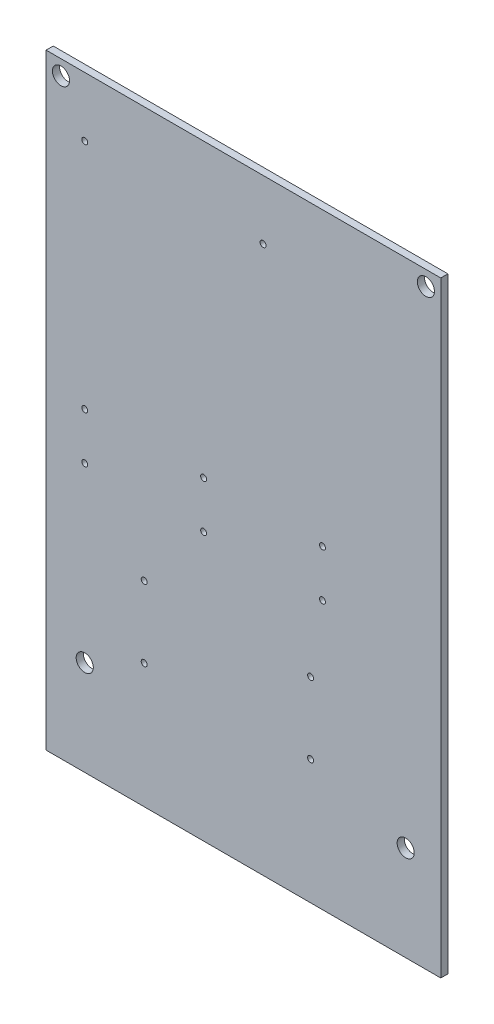
ISO-10303-21;
HEADER;
FILE_DESCRIPTION(('STEP AP214'),'2;1');
FILE_NAME('part.step','',(''),(''),'','','');
FILE_SCHEMA(('AUTOMOTIVE_DESIGN { 1 0 10303 214 1 1 1 1 }'));
ENDSEC;
DATA;
#1=APPLICATION_CONTEXT('core data for automotive mechanical design processes');
#2=APPLICATION_PROTOCOL_DEFINITION('international standard','automotive_design',2000,#1);
#3=PRODUCT_CONTEXT('',#1,'mechanical');
#4=PRODUCT('Part','Part','',(#3));
#5=PRODUCT_RELATED_PRODUCT_CATEGORY('part','',(#4));
#6=PRODUCT_DEFINITION_FORMATION('','',#4);
#7=PRODUCT_DEFINITION_CONTEXT('part definition',#1,'design');
#8=PRODUCT_DEFINITION('design','',#6,#7);
#9=PRODUCT_DEFINITION_SHAPE('','',#8);
#10=(LENGTH_UNIT() NAMED_UNIT(*) SI_UNIT(.MILLI.,.METRE.));
#11=(NAMED_UNIT(*) PLANE_ANGLE_UNIT() SI_UNIT($,.RADIAN.));
#12=(NAMED_UNIT(*) SI_UNIT($,.STERADIAN.) SOLID_ANGLE_UNIT());
#13=UNCERTAINTY_MEASURE_WITH_UNIT(LENGTH_MEASURE(1.E-05),#10,'distance_accuracy_value','');
#14=(GEOMETRIC_REPRESENTATION_CONTEXT(3) GLOBAL_UNCERTAINTY_ASSIGNED_CONTEXT((#13)) GLOBAL_UNIT_ASSIGNED_CONTEXT((#10,
#11,#12)) REPRESENTATION_CONTEXT('',''));
#15=CARTESIAN_POINT('',(0.,0.,0.));
#16=DIRECTION('',(0.,0.,1.));
#17=DIRECTION('',(1.,0.,0.));
#18=AXIS2_PLACEMENT_3D('',#15,#16,#17);
#19=CARTESIAN_POINT('',(42.164,82.55,1.524));
#20=DIRECTION('',(0.,0.,-1.));
#21=DIRECTION('',(-1.,0.,0.));
#22=AXIS2_PLACEMENT_3D('',#19,#20,#21);
#23=PLANE('',#22);
#24=CARTESIAN_POINT('',(14.351,-20.4,1.524));
#25=DIRECTION('',(0.,0.,1.));
#26=DIRECTION('',(1.,0.,0.));
#27=AXIS2_PLACEMENT_3D('',#24,#25,#26);
#28=CIRCLE('',#27,0.634999999999999);
#29=CARTESIAN_POINT('',(14.986,-20.4,1.524));
#30=VERTEX_POINT('',#29);
#31=EDGE_CURVE('E184',#30,#30,#28,.T.);
#32=ORIENTED_EDGE('',*,*,#31,.F.);
#33=EDGE_LOOP('',(#32));
#34=FACE_BOUND('',#33,.T.);
#35=CARTESIAN_POINT('',(-21.209,-20.4,1.524));
#36=DIRECTION('',(0.,0.,1.));
#37=DIRECTION('',(1.,0.,0.));
#38=AXIS2_PLACEMENT_3D('',#35,#36,#37);
#39=CIRCLE('',#38,0.634999999999999);
#40=CARTESIAN_POINT('',(-20.574,-20.4,1.524));
#41=VERTEX_POINT('',#40);
#42=EDGE_CURVE('E178',#41,#41,#39,.T.);
#43=ORIENTED_EDGE('',*,*,#42,.F.);
#44=EDGE_LOOP('',(#43));
#45=FACE_BOUND('',#44,.T.);
#46=CARTESIAN_POINT('',(14.351,-5.16,1.524));
#47=DIRECTION('',(0.,0.,1.));
#48=DIRECTION('',(1.,0.,0.));
#49=AXIS2_PLACEMENT_3D('',#46,#47,#48);
#50=CIRCLE('',#49,0.634999999999999);
#51=CARTESIAN_POINT('',(14.986,-5.16,1.524));
#52=VERTEX_POINT('',#51);
#53=EDGE_CURVE('E172',#52,#52,#50,.T.);
#54=ORIENTED_EDGE('',*,*,#53,.F.);
#55=EDGE_LOOP('',(#54));
#56=FACE_BOUND('',#55,.T.);
#57=CARTESIAN_POINT('',(-21.209,-5.16,1.524));
#58=DIRECTION('',(0.,0.,1.));
#59=DIRECTION('',(1.,0.,0.));
#60=AXIS2_PLACEMENT_3D('',#57,#58,#59);
#61=CIRCLE('',#60,0.634999999999999);
#62=CARTESIAN_POINT('',(-20.574,-5.16,1.524));
#63=VERTEX_POINT('',#62);
#64=EDGE_CURVE('E166',#63,#63,#61,.T.);
#65=ORIENTED_EDGE('',*,*,#64,.F.);
#66=EDGE_LOOP('',(#65));
#67=FACE_BOUND('',#66,.T.);
#68=CARTESIAN_POINT('',(16.891,10.24,1.524));
#69=DIRECTION('',(0.,0.,1.));
#70=DIRECTION('',(1.,0.,0.));
#71=AXIS2_PLACEMENT_3D('',#68,#69,#70);
#72=CIRCLE('',#71,0.634999999999995);
#73=CARTESIAN_POINT('',(17.526,10.24,1.524));
#74=VERTEX_POINT('',#73);
#75=EDGE_CURVE('E160',#74,#74,#72,.T.);
#76=ORIENTED_EDGE('',*,*,#75,.F.);
#77=EDGE_LOOP('',(#76));
#78=FACE_BOUND('',#77,.T.);
#79=CARTESIAN_POINT('',(16.891,20.24,1.524));
#80=DIRECTION('',(0.,0.,1.));
#81=DIRECTION('',(1.,0.,0.));
#82=AXIS2_PLACEMENT_3D('',#79,#80,#81);
#83=CIRCLE('',#82,0.634999999999995);
#84=CARTESIAN_POINT('',(17.526,20.24,1.524));
#85=VERTEX_POINT('',#84);
#86=EDGE_CURVE('E154',#85,#85,#83,.T.);
#87=ORIENTED_EDGE('',*,*,#86,.F.);
#88=EDGE_LOOP('',(#87));
#89=FACE_BOUND('',#88,.T.);
#90=CARTESIAN_POINT('',(-8.509,10.24,1.524));
#91=DIRECTION('',(0.,0.,1.));
#92=DIRECTION('',(1.,0.,0.));
#93=AXIS2_PLACEMENT_3D('',#90,#91,#92);
#94=CIRCLE('',#93,0.634999999999995);
#95=CARTESIAN_POINT('',(-7.87400000000001,10.24,1.524));
#96=VERTEX_POINT('',#95);
#97=EDGE_CURVE('E148',#96,#96,#94,.T.);
#98=ORIENTED_EDGE('',*,*,#97,.F.);
#99=EDGE_LOOP('',(#98));
#100=FACE_BOUND('',#99,.T.);
#101=CARTESIAN_POINT('',(-8.509,20.24,1.524));
#102=DIRECTION('',(0.,0.,1.));
#103=DIRECTION('',(1.,0.,0.));
#104=AXIS2_PLACEMENT_3D('',#101,#102,#103);
#105=CIRCLE('',#104,0.634999999999995);
#106=CARTESIAN_POINT('',(-7.87400000000001,20.24,1.524));
#107=VERTEX_POINT('',#106);
#108=EDGE_CURVE('E142',#107,#107,#105,.T.);
#109=ORIENTED_EDGE('',*,*,#108,.F.);
#110=EDGE_LOOP('',(#109));
#111=FACE_BOUND('',#110,.T.);
#112=CARTESIAN_POINT('',(-33.909,10.24,1.524));
#113=DIRECTION('',(0.,0.,1.));
#114=DIRECTION('',(1.,0.,0.));
#115=AXIS2_PLACEMENT_3D('',#112,#113,#114);
#116=CIRCLE('',#115,0.634999999999995);
#117=CARTESIAN_POINT('',(-33.274,10.24,1.524));
#118=VERTEX_POINT('',#117);
#119=EDGE_CURVE('E136',#118,#118,#116,.T.);
#120=ORIENTED_EDGE('',*,*,#119,.F.);
#121=EDGE_LOOP('',(#120));
#122=FACE_BOUND('',#121,.T.);
#123=CARTESIAN_POINT('',(-33.909,20.24,1.524));
#124=DIRECTION('',(0.,0.,1.));
#125=DIRECTION('',(1.,0.,0.));
#126=AXIS2_PLACEMENT_3D('',#123,#124,#125);
#127=CIRCLE('',#126,0.634999999999995);
#128=CARTESIAN_POINT('',(-33.274,20.24,1.524));
#129=VERTEX_POINT('',#128);
#130=EDGE_CURVE('E130',#129,#129,#127,.T.);
#131=ORIENTED_EDGE('',*,*,#130,.F.);
#132=EDGE_LOOP('',(#131));
#133=FACE_BOUND('',#132,.T.);
#134=CARTESIAN_POINT('',(4.19100000000001,69.85,1.524));
#135=DIRECTION('',(0.,0.,1.));
#136=DIRECTION('',(1.,0.,0.));
#137=AXIS2_PLACEMENT_3D('',#134,#135,#136);
#138=CIRCLE('',#137,0.634999999999999);
#139=CARTESIAN_POINT('',(4.82600000000001,69.85,1.524));
#140=VERTEX_POINT('',#139);
#141=EDGE_CURVE('E124',#140,#140,#138,.T.);
#142=ORIENTED_EDGE('',*,*,#141,.F.);
#143=EDGE_LOOP('',(#142));
#144=FACE_BOUND('',#143,.T.);
#145=CARTESIAN_POINT('',(-33.909,69.85,1.524));
#146=DIRECTION('',(0.,0.,1.));
#147=DIRECTION('',(1.,0.,0.));
#148=AXIS2_PLACEMENT_3D('',#145,#146,#147);
#149=CIRCLE('',#148,0.634999999999996);
#150=CARTESIAN_POINT('',(-33.274,69.85,1.524));
#151=VERTEX_POINT('',#150);
#152=EDGE_CURVE('E118',#151,#151,#149,.T.);
#153=ORIENTED_EDGE('',*,*,#152,.F.);
#154=EDGE_LOOP('',(#153));
#155=FACE_BOUND('',#154,.T.);
#156=CARTESIAN_POINT('',(-33.909,-26.67,1.524));
#157=DIRECTION('',(0.,0.,1.));
#158=DIRECTION('',(1.,0.,0.));
#159=AXIS2_PLACEMENT_3D('',#156,#157,#158);
#160=CIRCLE('',#159,1.8288);
#161=CARTESIAN_POINT('',(-35.7378,-26.67,1.524));
#162=VERTEX_POINT('',#161);
#163=EDGE_CURVE('E103',#162,#162,#160,.T.);
#164=ORIENTED_EDGE('',*,*,#163,.F.);
#165=EDGE_LOOP('',(#164));
#166=FACE_BOUND('',#165,.T.);
#167=CARTESIAN_POINT('',(-38.989,79.375,1.524));
#168=DIRECTION('',(0.,0.,1.));
#169=DIRECTION('',(1.,0.,0.));
#170=AXIS2_PLACEMENT_3D('',#167,#168,#169);
#171=CIRCLE('',#170,1.8288);
#172=CARTESIAN_POINT('',(-40.8178,79.375,1.524));
#173=VERTEX_POINT('',#172);
#174=EDGE_CURVE('E91',#173,#173,#171,.T.);
#175=ORIENTED_EDGE('',*,*,#174,.F.);
#176=EDGE_LOOP('',(#175));
#177=FACE_BOUND('',#176,.T.);
#178=DIRECTION('',(0.,-1.,0.));
#179=VECTOR('',#178,1.);
#180=CARTESIAN_POINT('',(-42.164,-82.55,1.524));
#181=LINE('',#180,#179);
#182=CARTESIAN_POINT('',(-42.164,82.55,1.524));
#183=VERTEX_POINT('',#182);
#184=CARTESIAN_POINT('',(-42.164,-46.99,1.524));
#185=VERTEX_POINT('',#184);
#186=EDGE_CURVE('E80',#183,#185,#181,.T.);
#187=ORIENTED_EDGE('',*,*,#186,.T.);
#188=DIRECTION('',(-1.,0.,0.));
#189=VECTOR('',#188,1.);
#190=CARTESIAN_POINT('',(-42.164,-46.99,1.524));
#191=LINE('',#190,#189);
#192=CARTESIAN_POINT('',(42.164,-46.99,1.524));
#193=VERTEX_POINT('',#192);
#194=EDGE_CURVE('E45',#193,#185,#191,.T.);
#195=ORIENTED_EDGE('',*,*,#194,.F.);
#196=DIRECTION('',(0.,1.,0.));
#197=VECTOR('',#196,1.);
#198=CARTESIAN_POINT('',(42.164,-82.55,1.524));
#199=LINE('',#198,#197);
#200=CARTESIAN_POINT('',(42.164,82.55,1.524));
#201=VERTEX_POINT('',#200);
#202=EDGE_CURVE('E86',#193,#201,#199,.T.);
#203=ORIENTED_EDGE('',*,*,#202,.T.);
#204=DIRECTION('',(-1.,0.,0.));
#205=VECTOR('',#204,1.);
#206=CARTESIAN_POINT('',(-42.164,82.55,1.524));
#207=LINE('',#206,#205);
#208=EDGE_CURVE('E54',#201,#183,#207,.T.);
#209=ORIENTED_EDGE('',*,*,#208,.T.);
#210=EDGE_LOOP('',(#187,#195,#203,#209));
#211=FACE_BOUND('',#210,.T.);
#212=CARTESIAN_POINT('',(38.989,79.375,1.524));
#213=DIRECTION('',(0.,0.,1.));
#214=DIRECTION('',(1.,0.,0.));
#215=AXIS2_PLACEMENT_3D('',#212,#213,#214);
#216=CIRCLE('',#215,1.8288);
#217=CARTESIAN_POINT('',(37.1602,79.375,1.524));
#218=VERTEX_POINT('',#217);
#219=EDGE_CURVE('E97',#218,#218,#216,.T.);
#220=ORIENTED_EDGE('',*,*,#219,.F.);
#221=EDGE_LOOP('',(#220));
#222=FACE_BOUND('',#221,.T.);
#223=CARTESIAN_POINT('',(34.671,-26.67,1.524));
#224=DIRECTION('',(0.,0.,1.));
#225=DIRECTION('',(1.,0.,0.));
#226=AXIS2_PLACEMENT_3D('',#223,#224,#225);
#227=CIRCLE('',#226,1.8288);
#228=CARTESIAN_POINT('',(32.8422,-26.67,1.524));
#229=VERTEX_POINT('',#228);
#230=EDGE_CURVE('E109',#229,#229,#227,.T.);
#231=ORIENTED_EDGE('',*,*,#230,.F.);
#232=EDGE_LOOP('',(#231));
#233=FACE_BOUND('',#232,.T.);
#234=ADVANCED_FACE('F30',(#34,#45,#56,#67,#78,#89,#100,#111,#122,#133,#144,#155,#166,#177,#211,
#222,#233),#23,.F.);
#235=CARTESIAN_POINT('',(42.164,82.55,0.));
#236=DIRECTION('',(0.,0.,-1.));
#237=DIRECTION('',(-1.,0.,0.));
#238=AXIS2_PLACEMENT_3D('',#235,#236,#237);
#239=PLANE('',#238);
#240=DIRECTION('',(-1.,0.,0.));
#241=VECTOR('',#240,1.);
#242=CARTESIAN_POINT('',(-42.164,-46.99,0.));
#243=LINE('',#242,#241);
#244=CARTESIAN_POINT('',(42.164,-46.99,0.));
#245=VERTEX_POINT('',#244);
#246=CARTESIAN_POINT('',(-42.164,-46.99,0.));
#247=VERTEX_POINT('',#246);
#248=EDGE_CURVE('E85',#245,#247,#243,.T.);
#249=ORIENTED_EDGE('',*,*,#248,.T.);
#250=DIRECTION('',(0.,-1.,0.));
#251=VECTOR('',#250,1.);
#252=CARTESIAN_POINT('',(-42.164,-82.55,0.));
#253=LINE('',#252,#251);
#254=CARTESIAN_POINT('',(-42.164,82.55,0.));
#255=VERTEX_POINT('',#254);
#256=EDGE_CURVE('E74',#255,#247,#253,.T.);
#257=ORIENTED_EDGE('',*,*,#256,.F.);
#258=DIRECTION('',(-1.,0.,0.));
#259=VECTOR('',#258,1.);
#260=CARTESIAN_POINT('',(-42.164,82.55,0.));
#261=LINE('',#260,#259);
#262=CARTESIAN_POINT('',(42.164,82.55,0.));
#263=VERTEX_POINT('',#262);
#264=EDGE_CURVE('E66',#263,#255,#261,.T.);
#265=ORIENTED_EDGE('',*,*,#264,.F.);
#266=DIRECTION('',(0.,1.,0.));
#267=VECTOR('',#266,1.);
#268=CARTESIAN_POINT('',(42.164,-82.55,0.));
#269=LINE('',#268,#267);
#270=EDGE_CURVE('E75',#245,#263,#269,.T.);
#271=ORIENTED_EDGE('',*,*,#270,.F.);
#272=EDGE_LOOP('',(#249,#257,#265,#271));
#273=FACE_BOUND('',#272,.T.);
#274=CARTESIAN_POINT('',(14.351,-20.4,0.));
#275=DIRECTION('',(0.,0.,1.));
#276=DIRECTION('',(1.,0.,0.));
#277=AXIS2_PLACEMENT_3D('',#274,#275,#276);
#278=CIRCLE('',#277,0.634999999999999);
#279=CARTESIAN_POINT('',(14.986,-20.4,0.));
#280=VERTEX_POINT('',#279);
#281=EDGE_CURVE('E181',#280,#280,#278,.T.);
#282=ORIENTED_EDGE('',*,*,#281,.T.);
#283=EDGE_LOOP('',(#282));
#284=FACE_BOUND('',#283,.T.);
#285=CARTESIAN_POINT('',(-21.209,-20.4,0.));
#286=DIRECTION('',(0.,0.,1.));
#287=DIRECTION('',(1.,0.,0.));
#288=AXIS2_PLACEMENT_3D('',#285,#286,#287);
#289=CIRCLE('',#288,0.634999999999999);
#290=CARTESIAN_POINT('',(-20.574,-20.4,0.));
#291=VERTEX_POINT('',#290);
#292=EDGE_CURVE('E175',#291,#291,#289,.T.);
#293=ORIENTED_EDGE('',*,*,#292,.T.);
#294=EDGE_LOOP('',(#293));
#295=FACE_BOUND('',#294,.T.);
#296=CARTESIAN_POINT('',(14.351,-5.16,0.));
#297=DIRECTION('',(0.,0.,1.));
#298=DIRECTION('',(1.,0.,0.));
#299=AXIS2_PLACEMENT_3D('',#296,#297,#298);
#300=CIRCLE('',#299,0.634999999999999);
#301=CARTESIAN_POINT('',(14.986,-5.16,0.));
#302=VERTEX_POINT('',#301);
#303=EDGE_CURVE('E169',#302,#302,#300,.T.);
#304=ORIENTED_EDGE('',*,*,#303,.T.);
#305=EDGE_LOOP('',(#304));
#306=FACE_BOUND('',#305,.T.);
#307=CARTESIAN_POINT('',(-21.209,-5.16,0.));
#308=DIRECTION('',(0.,0.,1.));
#309=DIRECTION('',(1.,0.,0.));
#310=AXIS2_PLACEMENT_3D('',#307,#308,#309);
#311=CIRCLE('',#310,0.634999999999999);
#312=CARTESIAN_POINT('',(-20.574,-5.16,0.));
#313=VERTEX_POINT('',#312);
#314=EDGE_CURVE('E163',#313,#313,#311,.T.);
#315=ORIENTED_EDGE('',*,*,#314,.T.);
#316=EDGE_LOOP('',(#315));
#317=FACE_BOUND('',#316,.T.);
#318=CARTESIAN_POINT('',(16.891,10.24,0.));
#319=DIRECTION('',(0.,0.,1.));
#320=DIRECTION('',(1.,0.,0.));
#321=AXIS2_PLACEMENT_3D('',#318,#319,#320);
#322=CIRCLE('',#321,0.634999999999995);
#323=CARTESIAN_POINT('',(17.526,10.24,0.));
#324=VERTEX_POINT('',#323);
#325=EDGE_CURVE('E157',#324,#324,#322,.T.);
#326=ORIENTED_EDGE('',*,*,#325,.T.);
#327=EDGE_LOOP('',(#326));
#328=FACE_BOUND('',#327,.T.);
#329=CARTESIAN_POINT('',(16.891,20.24,0.));
#330=DIRECTION('',(0.,0.,1.));
#331=DIRECTION('',(1.,0.,0.));
#332=AXIS2_PLACEMENT_3D('',#329,#330,#331);
#333=CIRCLE('',#332,0.634999999999995);
#334=CARTESIAN_POINT('',(17.526,20.24,0.));
#335=VERTEX_POINT('',#334);
#336=EDGE_CURVE('E151',#335,#335,#333,.T.);
#337=ORIENTED_EDGE('',*,*,#336,.T.);
#338=EDGE_LOOP('',(#337));
#339=FACE_BOUND('',#338,.T.);
#340=CARTESIAN_POINT('',(-8.509,10.24,0.));
#341=DIRECTION('',(0.,0.,1.));
#342=DIRECTION('',(1.,0.,0.));
#343=AXIS2_PLACEMENT_3D('',#340,#341,#342);
#344=CIRCLE('',#343,0.634999999999995);
#345=CARTESIAN_POINT('',(-7.87400000000001,10.24,0.));
#346=VERTEX_POINT('',#345);
#347=EDGE_CURVE('E145',#346,#346,#344,.T.);
#348=ORIENTED_EDGE('',*,*,#347,.T.);
#349=EDGE_LOOP('',(#348));
#350=FACE_BOUND('',#349,.T.);
#351=CARTESIAN_POINT('',(-8.509,20.24,0.));
#352=DIRECTION('',(0.,0.,1.));
#353=DIRECTION('',(1.,0.,0.));
#354=AXIS2_PLACEMENT_3D('',#351,#352,#353);
#355=CIRCLE('',#354,0.634999999999995);
#356=CARTESIAN_POINT('',(-7.87400000000001,20.24,0.));
#357=VERTEX_POINT('',#356);
#358=EDGE_CURVE('E139',#357,#357,#355,.T.);
#359=ORIENTED_EDGE('',*,*,#358,.T.);
#360=EDGE_LOOP('',(#359));
#361=FACE_BOUND('',#360,.T.);
#362=CARTESIAN_POINT('',(-33.909,10.24,0.));
#363=DIRECTION('',(0.,0.,1.));
#364=DIRECTION('',(1.,0.,0.));
#365=AXIS2_PLACEMENT_3D('',#362,#363,#364);
#366=CIRCLE('',#365,0.634999999999995);
#367=CARTESIAN_POINT('',(-33.274,10.24,0.));
#368=VERTEX_POINT('',#367);
#369=EDGE_CURVE('E133',#368,#368,#366,.T.);
#370=ORIENTED_EDGE('',*,*,#369,.T.);
#371=EDGE_LOOP('',(#370));
#372=FACE_BOUND('',#371,.T.);
#373=CARTESIAN_POINT('',(-33.909,20.24,0.));
#374=DIRECTION('',(0.,0.,1.));
#375=DIRECTION('',(1.,0.,0.));
#376=AXIS2_PLACEMENT_3D('',#373,#374,#375);
#377=CIRCLE('',#376,0.634999999999995);
#378=CARTESIAN_POINT('',(-33.274,20.24,0.));
#379=VERTEX_POINT('',#378);
#380=EDGE_CURVE('E127',#379,#379,#377,.T.);
#381=ORIENTED_EDGE('',*,*,#380,.T.);
#382=EDGE_LOOP('',(#381));
#383=FACE_BOUND('',#382,.T.);
#384=CARTESIAN_POINT('',(4.19100000000001,69.85,0.));
#385=DIRECTION('',(0.,0.,1.));
#386=DIRECTION('',(1.,0.,0.));
#387=AXIS2_PLACEMENT_3D('',#384,#385,#386);
#388=CIRCLE('',#387,0.634999999999999);
#389=CARTESIAN_POINT('',(4.82600000000001,69.85,0.));
#390=VERTEX_POINT('',#389);
#391=EDGE_CURVE('E121',#390,#390,#388,.T.);
#392=ORIENTED_EDGE('',*,*,#391,.T.);
#393=EDGE_LOOP('',(#392));
#394=FACE_BOUND('',#393,.T.);
#395=CARTESIAN_POINT('',(-33.909,69.85,0.));
#396=DIRECTION('',(0.,0.,1.));
#397=DIRECTION('',(1.,0.,0.));
#398=AXIS2_PLACEMENT_3D('',#395,#396,#397);
#399=CIRCLE('',#398,0.634999999999996);
#400=CARTESIAN_POINT('',(-33.274,69.85,0.));
#401=VERTEX_POINT('',#400);
#402=EDGE_CURVE('E115',#401,#401,#399,.T.);
#403=ORIENTED_EDGE('',*,*,#402,.T.);
#404=EDGE_LOOP('',(#403));
#405=FACE_BOUND('',#404,.T.);
#406=CARTESIAN_POINT('',(-33.909,-26.67,0.));
#407=DIRECTION('',(0.,0.,1.));
#408=DIRECTION('',(1.,0.,0.));
#409=AXIS2_PLACEMENT_3D('',#406,#407,#408);
#410=CIRCLE('',#409,1.8288);
#411=CARTESIAN_POINT('',(-35.7378,-26.67,0.));
#412=VERTEX_POINT('',#411);
#413=EDGE_CURVE('E106',#412,#412,#410,.T.);
#414=ORIENTED_EDGE('',*,*,#413,.T.);
#415=EDGE_LOOP('',(#414));
#416=FACE_BOUND('',#415,.T.);
#417=CARTESIAN_POINT('',(-38.989,79.375,0.));
#418=DIRECTION('',(0.,0.,1.));
#419=DIRECTION('',(1.,0.,0.));
#420=AXIS2_PLACEMENT_3D('',#417,#418,#419);
#421=CIRCLE('',#420,1.8288);
#422=CARTESIAN_POINT('',(-40.8178,79.375,0.));
#423=VERTEX_POINT('',#422);
#424=EDGE_CURVE('E94',#423,#423,#421,.T.);
#425=ORIENTED_EDGE('',*,*,#424,.T.);
#426=EDGE_LOOP('',(#425));
#427=FACE_BOUND('',#426,.T.);
#428=CARTESIAN_POINT('',(38.989,79.375,0.));
#429=DIRECTION('',(0.,0.,1.));
#430=DIRECTION('',(1.,0.,0.));
#431=AXIS2_PLACEMENT_3D('',#428,#429,#430);
#432=CIRCLE('',#431,1.8288);
#433=CARTESIAN_POINT('',(37.1602,79.375,0.));
#434=VERTEX_POINT('',#433);
#435=EDGE_CURVE('E100',#434,#434,#432,.T.);
#436=ORIENTED_EDGE('',*,*,#435,.T.);
#437=EDGE_LOOP('',(#436));
#438=FACE_BOUND('',#437,.T.);
#439=CARTESIAN_POINT('',(34.671,-26.67,0.));
#440=DIRECTION('',(0.,0.,1.));
#441=DIRECTION('',(1.,0.,0.));
#442=AXIS2_PLACEMENT_3D('',#439,#440,#441);
#443=CIRCLE('',#442,1.8288);
#444=CARTESIAN_POINT('',(32.8422,-26.67,0.));
#445=VERTEX_POINT('',#444);
#446=EDGE_CURVE('E112',#445,#445,#443,.T.);
#447=ORIENTED_EDGE('',*,*,#446,.T.);
#448=EDGE_LOOP('',(#447));
#449=FACE_BOUND('',#448,.T.);
#450=ADVANCED_FACE('F82',(#273,#284,#295,#306,#317,#328,#339,#350,#361,#372,#383,#394,#405,#416,
#427,#438,#449),#239,.T.);
#451=CARTESIAN_POINT('',(42.164,-82.55,1.524));
#452=DIRECTION('',(-1.,0.,0.));
#453=DIRECTION('',(0.,0.,1.));
#454=AXIS2_PLACEMENT_3D('',#451,#452,#453);
#455=PLANE('',#454);
#456=ORIENTED_EDGE('',*,*,#202,.F.);
#457=DIRECTION('',(0.,0.,1.));
#458=VECTOR('',#457,1.);
#459=CARTESIAN_POINT('',(42.164,-46.99,0.));
#460=LINE('',#459,#458);
#461=EDGE_CURVE('E190',#245,#193,#460,.T.);
#462=ORIENTED_EDGE('',*,*,#461,.F.);
#463=ORIENTED_EDGE('',*,*,#270,.T.);
#464=DIRECTION('',(0.,0.,-1.));
#465=VECTOR('',#464,1.);
#466=CARTESIAN_POINT('',(42.164,82.55,1.524));
#467=LINE('',#466,#465);
#468=EDGE_CURVE('E11',#201,#263,#467,.T.);
#469=ORIENTED_EDGE('',*,*,#468,.F.);
#470=EDGE_LOOP('',(#456,#462,#463,#469));
#471=FACE_BOUND('',#470,.T.);
#472=ADVANCED_FACE('F32',(#471),#455,.F.);
#473=CARTESIAN_POINT('',(-42.164,82.55,1.524));
#474=DIRECTION('',(0.,-1.,0.));
#475=DIRECTION('',(0.,0.,-1.));
#476=AXIS2_PLACEMENT_3D('',#473,#474,#475);
#477=PLANE('',#476);
#478=ORIENTED_EDGE('',*,*,#264,.T.);
#479=DIRECTION('',(0.,0.,-1.));
#480=VECTOR('',#479,1.);
#481=CARTESIAN_POINT('',(-42.164,82.55,1.524));
#482=LINE('',#481,#480);
#483=EDGE_CURVE('E38',#183,#255,#482,.T.);
#484=ORIENTED_EDGE('',*,*,#483,.F.);
#485=ORIENTED_EDGE('',*,*,#208,.F.);
#486=ORIENTED_EDGE('',*,*,#468,.T.);
#487=EDGE_LOOP('',(#478,#484,#485,#486));
#488=FACE_BOUND('',#487,.T.);
#489=ADVANCED_FACE('F68',(#488),#477,.F.);
#490=CARTESIAN_POINT('',(-42.164,-82.55,1.524));
#491=DIRECTION('',(1.,0.,0.));
#492=DIRECTION('',(0.,0.,-1.));
#493=AXIS2_PLACEMENT_3D('',#490,#491,#492);
#494=PLANE('',#493);
#495=ORIENTED_EDGE('',*,*,#256,.T.);
#496=DIRECTION('',(0.,0.,1.));
#497=VECTOR('',#496,1.);
#498=CARTESIAN_POINT('',(-42.164,-46.99,0.));
#499=LINE('',#498,#497);
#500=EDGE_CURVE('E187',#247,#185,#499,.T.);
#501=ORIENTED_EDGE('',*,*,#500,.T.);
#502=ORIENTED_EDGE('',*,*,#186,.F.);
#503=ORIENTED_EDGE('',*,*,#483,.T.);
#504=EDGE_LOOP('',(#495,#501,#502,#503));
#505=FACE_BOUND('',#504,.T.);
#506=ADVANCED_FACE('F79',(#505),#494,.F.);
#507=CARTESIAN_POINT('',(-38.989,79.375,1.524));
#508=DIRECTION('',(0.,0.,-1.));
#509=DIRECTION('',(-1.,0.,0.));
#510=AXIS2_PLACEMENT_3D('',#507,#508,#509);
#511=CYLINDRICAL_SURFACE('',#510,1.8288);
#512=CARTESIAN_POINT('',(-40.8178,79.375,1.524));
#513=CARTESIAN_POINT('',(-40.8178,79.375,1.508125));
#514=CARTESIAN_POINT('',(-40.8178,79.375,1.49225));
#515=CARTESIAN_POINT('',(-40.8178,79.375,1.4605));
#516=CARTESIAN_POINT('',(-40.8178,79.375,1.444625));
#517=CARTESIAN_POINT('',(-40.8178,79.375,1.412875));
#518=CARTESIAN_POINT('',(-40.8178,79.375,1.397));
#519=CARTESIAN_POINT('',(-40.8178,79.375,1.36525));
#520=CARTESIAN_POINT('',(-40.8178,79.375,1.349375));
#521=CARTESIAN_POINT('',(-40.8178,79.375,1.317625));
#522=CARTESIAN_POINT('',(-40.8178,79.375,1.30175));
#523=CARTESIAN_POINT('',(-40.8178,79.375,1.27));
#524=CARTESIAN_POINT('',(-40.8178,79.375,1.254125));
#525=CARTESIAN_POINT('',(-40.8178,79.375,1.222375));
#526=CARTESIAN_POINT('',(-40.8178,79.375,1.2065));
#527=CARTESIAN_POINT('',(-40.8178,79.375,1.17475));
#528=CARTESIAN_POINT('',(-40.8178,79.375,1.158875));
#529=CARTESIAN_POINT('',(-40.8178,79.375,1.127125));
#530=CARTESIAN_POINT('',(-40.8178,79.375,1.11125));
#531=CARTESIAN_POINT('',(-40.8178,79.375,1.0795));
#532=CARTESIAN_POINT('',(-40.8178,79.375,1.063625));
#533=CARTESIAN_POINT('',(-40.8178,79.375,1.031875));
#534=CARTESIAN_POINT('',(-40.8178,79.375,1.016));
#535=CARTESIAN_POINT('',(-40.8178,79.375,0.98425));
#536=CARTESIAN_POINT('',(-40.8178,79.375,0.968375));
#537=CARTESIAN_POINT('',(-40.8178,79.375,0.936625));
#538=CARTESIAN_POINT('',(-40.8178,79.375,0.92075));
#539=CARTESIAN_POINT('',(-40.8178,79.375,0.889));
#540=CARTESIAN_POINT('',(-40.8178,79.375,0.873125));
#541=CARTESIAN_POINT('',(-40.8178,79.375,0.841375));
#542=CARTESIAN_POINT('',(-40.8178,79.375,0.8255));
#543=CARTESIAN_POINT('',(-40.8178,79.375,0.79375));
#544=CARTESIAN_POINT('',(-40.8178,79.375,0.777875));
#545=CARTESIAN_POINT('',(-40.8178,79.375,0.746125));
#546=CARTESIAN_POINT('',(-40.8178,79.375,0.73025));
#547=CARTESIAN_POINT('',(-40.8178,79.375,0.6985));
#548=CARTESIAN_POINT('',(-40.8178,79.375,0.682625));
#549=CARTESIAN_POINT('',(-40.8178,79.375,0.650875));
#550=CARTESIAN_POINT('',(-40.8178,79.375,0.635));
#551=CARTESIAN_POINT('',(-40.8178,79.375,0.60325));
#552=CARTESIAN_POINT('',(-40.8178,79.375,0.587375));
#553=CARTESIAN_POINT('',(-40.8178,79.375,0.555625));
#554=CARTESIAN_POINT('',(-40.8178,79.375,0.53975));
#555=CARTESIAN_POINT('',(-40.8178,79.375,0.508));
#556=CARTESIAN_POINT('',(-40.8178,79.375,0.492125));
#557=CARTESIAN_POINT('',(-40.8178,79.375,0.460375));
#558=CARTESIAN_POINT('',(-40.8178,79.375,0.4445));
#559=CARTESIAN_POINT('',(-40.8178,79.375,0.41275));
#560=CARTESIAN_POINT('',(-40.8178,79.375,0.396875));
#561=CARTESIAN_POINT('',(-40.8178,79.375,0.365125));
#562=CARTESIAN_POINT('',(-40.8178,79.375,0.34925));
#563=CARTESIAN_POINT('',(-40.8178,79.375,0.3175));
#564=CARTESIAN_POINT('',(-40.8178,79.375,0.301625));
#565=CARTESIAN_POINT('',(-40.8178,79.375,0.269875));
#566=CARTESIAN_POINT('',(-40.8178,79.375,0.254));
#567=CARTESIAN_POINT('',(-40.8178,79.375,0.22225));
#568=CARTESIAN_POINT('',(-40.8178,79.375,0.206375));
#569=CARTESIAN_POINT('',(-40.8178,79.375,0.174625));
#570=CARTESIAN_POINT('',(-40.8178,79.375,0.15875));
#571=CARTESIAN_POINT('',(-40.8178,79.375,0.127));
#572=CARTESIAN_POINT('',(-40.8178,79.375,0.111125));
#573=CARTESIAN_POINT('',(-40.8178,79.375,0.079375));
#574=CARTESIAN_POINT('',(-40.8178,79.375,0.0635));
#575=CARTESIAN_POINT('',(-40.8178,79.375,0.0317499999999999));
#576=CARTESIAN_POINT('',(-40.8178,79.375,0.015875));
#577=CARTESIAN_POINT('',(-40.8178,79.375,0.));
#578=B_SPLINE_CURVE_WITH_KNOTS('',3,(#512,#513,#514,#515,#516,#517,#518,#519,#520,#521,#522,
#523,#524,#525,#526,#527,#528,#529,#530,#531,#532,#533,#534,#535,#536,#537,#538,#539,#540,#541,
#542,#543,#544,#545,#546,#547,#548,#549,#550,#551,#552,#553,#554,#555,#556,#557,#558,#559,#560,
#561,#562,#563,#564,#565,#566,#567,#568,#569,#570,#571,#572,#573,#574,#575,#576,#577),
.UNSPECIFIED.,.F.,.F.,(4,2,2,2,2,2,2,2,2,2,2,2,2,2,2,2,2,2,2,2,2,2,2,2,2,2,2,2,2,2,2,2,4),(0.,
0.0476249999999999,0.0952499999999998,0.142875,0.1905,0.238125,0.28575,0.333375,0.381,0.428625,
0.47625,0.523875,0.5715,0.619125,0.66675,0.714375,0.762,0.809625,0.85725,0.904875,0.9525,
1.000125,1.04775,1.095375,1.143,1.190625,1.23825,1.285875,1.3335,1.381125,1.42875,1.476375,
1.524),.UNSPECIFIED.);
#579=EDGE_CURVE('BSEAM222',#173,#423,#578,.T.);
#580=ORIENTED_EDGE('',*,*,#174,.T.);
#581=ORIENTED_EDGE('',*,*,#424,.F.);
#582=ORIENTED_EDGE('',*,*,#579,.T.);
#583=ORIENTED_EDGE('',*,*,#579,.F.);
#584=EDGE_LOOP('',(#580,#582,#581,#583));
#585=FACE_BOUND('',#584,.T.);
#586=ADVANCED_FACE('F222',(#585),#511,.F.);
#587=CARTESIAN_POINT('',(38.989,79.375,1.524));
#588=DIRECTION('',(0.,0.,-1.));
#589=DIRECTION('',(-1.,0.,0.));
#590=AXIS2_PLACEMENT_3D('',#587,#588,#589);
#591=CYLINDRICAL_SURFACE('',#590,1.8288);
#592=CARTESIAN_POINT('',(37.1602,79.375,1.524));
#593=CARTESIAN_POINT('',(37.1602,79.375,1.508125));
#594=CARTESIAN_POINT('',(37.1602,79.375,1.49225));
#595=CARTESIAN_POINT('',(37.1602,79.375,1.4605));
#596=CARTESIAN_POINT('',(37.1602,79.375,1.444625));
#597=CARTESIAN_POINT('',(37.1602,79.375,1.412875));
#598=CARTESIAN_POINT('',(37.1602,79.375,1.397));
#599=CARTESIAN_POINT('',(37.1602,79.375,1.36525));
#600=CARTESIAN_POINT('',(37.1602,79.375,1.349375));
#601=CARTESIAN_POINT('',(37.1602,79.375,1.317625));
#602=CARTESIAN_POINT('',(37.1602,79.375,1.30175));
#603=CARTESIAN_POINT('',(37.1602,79.375,1.27));
#604=CARTESIAN_POINT('',(37.1602,79.375,1.254125));
#605=CARTESIAN_POINT('',(37.1602,79.375,1.222375));
#606=CARTESIAN_POINT('',(37.1602,79.375,1.2065));
#607=CARTESIAN_POINT('',(37.1602,79.375,1.17475));
#608=CARTESIAN_POINT('',(37.1602,79.375,1.158875));
#609=CARTESIAN_POINT('',(37.1602,79.375,1.127125));
#610=CARTESIAN_POINT('',(37.1602,79.375,1.11125));
#611=CARTESIAN_POINT('',(37.1602,79.375,1.0795));
#612=CARTESIAN_POINT('',(37.1602,79.375,1.063625));
#613=CARTESIAN_POINT('',(37.1602,79.375,1.031875));
#614=CARTESIAN_POINT('',(37.1602,79.375,1.016));
#615=CARTESIAN_POINT('',(37.1602,79.375,0.98425));
#616=CARTESIAN_POINT('',(37.1602,79.375,0.968375));
#617=CARTESIAN_POINT('',(37.1602,79.375,0.936625));
#618=CARTESIAN_POINT('',(37.1602,79.375,0.92075));
#619=CARTESIAN_POINT('',(37.1602,79.375,0.889));
#620=CARTESIAN_POINT('',(37.1602,79.375,0.873125));
#621=CARTESIAN_POINT('',(37.1602,79.375,0.841375));
#622=CARTESIAN_POINT('',(37.1602,79.375,0.8255));
#623=CARTESIAN_POINT('',(37.1602,79.375,0.79375));
#624=CARTESIAN_POINT('',(37.1602,79.375,0.777875));
#625=CARTESIAN_POINT('',(37.1602,79.375,0.746125));
#626=CARTESIAN_POINT('',(37.1602,79.375,0.73025));
#627=CARTESIAN_POINT('',(37.1602,79.375,0.6985));
#628=CARTESIAN_POINT('',(37.1602,79.375,0.682625));
#629=CARTESIAN_POINT('',(37.1602,79.375,0.650875));
#630=CARTESIAN_POINT('',(37.1602,79.375,0.635));
#631=CARTESIAN_POINT('',(37.1602,79.375,0.60325));
#632=CARTESIAN_POINT('',(37.1602,79.375,0.587375));
#633=CARTESIAN_POINT('',(37.1602,79.375,0.555625));
#634=CARTESIAN_POINT('',(37.1602,79.375,0.53975));
#635=CARTESIAN_POINT('',(37.1602,79.375,0.508));
#636=CARTESIAN_POINT('',(37.1602,79.375,0.492125));
#637=CARTESIAN_POINT('',(37.1602,79.375,0.460375));
#638=CARTESIAN_POINT('',(37.1602,79.375,0.4445));
#639=CARTESIAN_POINT('',(37.1602,79.375,0.41275));
#640=CARTESIAN_POINT('',(37.1602,79.375,0.396875));
#641=CARTESIAN_POINT('',(37.1602,79.375,0.365125));
#642=CARTESIAN_POINT('',(37.1602,79.375,0.34925));
#643=CARTESIAN_POINT('',(37.1602,79.375,0.3175));
#644=CARTESIAN_POINT('',(37.1602,79.375,0.301625));
#645=CARTESIAN_POINT('',(37.1602,79.375,0.269875));
#646=CARTESIAN_POINT('',(37.1602,79.375,0.254));
#647=CARTESIAN_POINT('',(37.1602,79.375,0.22225));
#648=CARTESIAN_POINT('',(37.1602,79.375,0.206375));
#649=CARTESIAN_POINT('',(37.1602,79.375,0.174625));
#650=CARTESIAN_POINT('',(37.1602,79.375,0.15875));
#651=CARTESIAN_POINT('',(37.1602,79.375,0.127));
#652=CARTESIAN_POINT('',(37.1602,79.375,0.111125));
#653=CARTESIAN_POINT('',(37.1602,79.375,0.079375));
#654=CARTESIAN_POINT('',(37.1602,79.375,0.0635));
#655=CARTESIAN_POINT('',(37.1602,79.375,0.0317499999999999));
#656=CARTESIAN_POINT('',(37.1602,79.375,0.015875));
#657=CARTESIAN_POINT('',(37.1602,79.375,0.));
#658=B_SPLINE_CURVE_WITH_KNOTS('',3,(#592,#593,#594,#595,#596,#597,#598,#599,#600,#601,#602,
#603,#604,#605,#606,#607,#608,#609,#610,#611,#612,#613,#614,#615,#616,#617,#618,#619,#620,#621,
#622,#623,#624,#625,#626,#627,#628,#629,#630,#631,#632,#633,#634,#635,#636,#637,#638,#639,#640,
#641,#642,#643,#644,#645,#646,#647,#648,#649,#650,#651,#652,#653,#654,#655,#656,#657),
.UNSPECIFIED.,.F.,.F.,(4,2,2,2,2,2,2,2,2,2,2,2,2,2,2,2,2,2,2,2,2,2,2,2,2,2,2,2,2,2,2,2,4),(0.,
0.0476249999999999,0.0952499999999998,0.142875,0.1905,0.238125,0.28575,0.333375,0.381,0.428625,
0.47625,0.523875,0.5715,0.619125,0.66675,0.714375,0.762,0.809625,0.85725,0.904875,0.9525,
1.000125,1.04775,1.095375,1.143,1.190625,1.23825,1.285875,1.3335,1.381125,1.42875,1.476375,
1.524),.UNSPECIFIED.);
#659=EDGE_CURVE('BSEAM377',#218,#434,#658,.T.);
#660=ORIENTED_EDGE('',*,*,#219,.T.);
#661=ORIENTED_EDGE('',*,*,#435,.F.);
#662=ORIENTED_EDGE('',*,*,#659,.T.);
#663=ORIENTED_EDGE('',*,*,#659,.F.);
#664=EDGE_LOOP('',(#660,#662,#661,#663));
#665=FACE_BOUND('',#664,.T.);
#666=ADVANCED_FACE('F377',(#665),#591,.F.);
#667=CARTESIAN_POINT('',(-33.909,-26.67,1.524));
#668=DIRECTION('',(0.,0.,-1.));
#669=DIRECTION('',(-1.,0.,0.));
#670=AXIS2_PLACEMENT_3D('',#667,#668,#669);
#671=CYLINDRICAL_SURFACE('',#670,1.8288);
#672=CARTESIAN_POINT('',(-35.7378,-26.67,1.524));
#673=CARTESIAN_POINT('',(-35.7378,-26.67,1.508125));
#674=CARTESIAN_POINT('',(-35.7378,-26.67,1.49225));
#675=CARTESIAN_POINT('',(-35.7378,-26.67,1.4605));
#676=CARTESIAN_POINT('',(-35.7378,-26.67,1.444625));
#677=CARTESIAN_POINT('',(-35.7378,-26.67,1.412875));
#678=CARTESIAN_POINT('',(-35.7378,-26.67,1.397));
#679=CARTESIAN_POINT('',(-35.7378,-26.67,1.36525));
#680=CARTESIAN_POINT('',(-35.7378,-26.67,1.349375));
#681=CARTESIAN_POINT('',(-35.7378,-26.67,1.317625));
#682=CARTESIAN_POINT('',(-35.7378,-26.67,1.30175));
#683=CARTESIAN_POINT('',(-35.7378,-26.67,1.27));
#684=CARTESIAN_POINT('',(-35.7378,-26.67,1.254125));
#685=CARTESIAN_POINT('',(-35.7378,-26.67,1.222375));
#686=CARTESIAN_POINT('',(-35.7378,-26.67,1.2065));
#687=CARTESIAN_POINT('',(-35.7378,-26.67,1.17475));
#688=CARTESIAN_POINT('',(-35.7378,-26.67,1.158875));
#689=CARTESIAN_POINT('',(-35.7378,-26.67,1.127125));
#690=CARTESIAN_POINT('',(-35.7378,-26.67,1.11125));
#691=CARTESIAN_POINT('',(-35.7378,-26.67,1.0795));
#692=CARTESIAN_POINT('',(-35.7378,-26.67,1.063625));
#693=CARTESIAN_POINT('',(-35.7378,-26.67,1.031875));
#694=CARTESIAN_POINT('',(-35.7378,-26.67,1.016));
#695=CARTESIAN_POINT('',(-35.7378,-26.67,0.98425));
#696=CARTESIAN_POINT('',(-35.7378,-26.67,0.968375));
#697=CARTESIAN_POINT('',(-35.7378,-26.67,0.936625));
#698=CARTESIAN_POINT('',(-35.7378,-26.67,0.92075));
#699=CARTESIAN_POINT('',(-35.7378,-26.67,0.889));
#700=CARTESIAN_POINT('',(-35.7378,-26.67,0.873125));
#701=CARTESIAN_POINT('',(-35.7378,-26.67,0.841375));
#702=CARTESIAN_POINT('',(-35.7378,-26.67,0.8255));
#703=CARTESIAN_POINT('',(-35.7378,-26.67,0.79375));
#704=CARTESIAN_POINT('',(-35.7378,-26.67,0.777875));
#705=CARTESIAN_POINT('',(-35.7378,-26.67,0.746125));
#706=CARTESIAN_POINT('',(-35.7378,-26.67,0.73025));
#707=CARTESIAN_POINT('',(-35.7378,-26.67,0.6985));
#708=CARTESIAN_POINT('',(-35.7378,-26.67,0.682625));
#709=CARTESIAN_POINT('',(-35.7378,-26.67,0.650875));
#710=CARTESIAN_POINT('',(-35.7378,-26.67,0.635));
#711=CARTESIAN_POINT('',(-35.7378,-26.67,0.60325));
#712=CARTESIAN_POINT('',(-35.7378,-26.67,0.587375));
#713=CARTESIAN_POINT('',(-35.7378,-26.67,0.555625));
#714=CARTESIAN_POINT('',(-35.7378,-26.67,0.53975));
#715=CARTESIAN_POINT('',(-35.7378,-26.67,0.508));
#716=CARTESIAN_POINT('',(-35.7378,-26.67,0.492125));
#717=CARTESIAN_POINT('',(-35.7378,-26.67,0.460375));
#718=CARTESIAN_POINT('',(-35.7378,-26.67,0.4445));
#719=CARTESIAN_POINT('',(-35.7378,-26.67,0.41275));
#720=CARTESIAN_POINT('',(-35.7378,-26.67,0.396875));
#721=CARTESIAN_POINT('',(-35.7378,-26.67,0.365125));
#722=CARTESIAN_POINT('',(-35.7378,-26.67,0.34925));
#723=CARTESIAN_POINT('',(-35.7378,-26.67,0.3175));
#724=CARTESIAN_POINT('',(-35.7378,-26.67,0.301625));
#725=CARTESIAN_POINT('',(-35.7378,-26.67,0.269875));
#726=CARTESIAN_POINT('',(-35.7378,-26.67,0.254));
#727=CARTESIAN_POINT('',(-35.7378,-26.67,0.22225));
#728=CARTESIAN_POINT('',(-35.7378,-26.67,0.206375));
#729=CARTESIAN_POINT('',(-35.7378,-26.67,0.174625));
#730=CARTESIAN_POINT('',(-35.7378,-26.67,0.15875));
#731=CARTESIAN_POINT('',(-35.7378,-26.67,0.127));
#732=CARTESIAN_POINT('',(-35.7378,-26.67,0.111125));
#733=CARTESIAN_POINT('',(-35.7378,-26.67,0.079375));
#734=CARTESIAN_POINT('',(-35.7378,-26.67,0.0635));
#735=CARTESIAN_POINT('',(-35.7378,-26.67,0.0317499999999999));
#736=CARTESIAN_POINT('',(-35.7378,-26.67,0.015875));
#737=CARTESIAN_POINT('',(-35.7378,-26.67,0.));
#738=B_SPLINE_CURVE_WITH_KNOTS('',3,(#672,#673,#674,#675,#676,#677,#678,#679,#680,#681,#682,
#683,#684,#685,#686,#687,#688,#689,#690,#691,#692,#693,#694,#695,#696,#697,#698,#699,#700,#701,
#702,#703,#704,#705,#706,#707,#708,#709,#710,#711,#712,#713,#714,#715,#716,#717,#718,#719,#720,
#721,#722,#723,#724,#725,#726,#727,#728,#729,#730,#731,#732,#733,#734,#735,#736,#737),
.UNSPECIFIED.,.F.,.F.,(4,2,2,2,2,2,2,2,2,2,2,2,2,2,2,2,2,2,2,2,2,2,2,2,2,2,2,2,2,2,2,2,4),(0.,
0.0476249999999999,0.0952499999999998,0.142875,0.1905,0.238125,0.28575,0.333375,0.381,0.428625,
0.47625,0.523875,0.5715,0.619125,0.66675,0.714375,0.762,0.809625,0.85725,0.904875,0.9525,
1.000125,1.04775,1.095375,1.143,1.190625,1.23825,1.285875,1.3335,1.381125,1.42875,1.476375,
1.524),.UNSPECIFIED.);
#739=EDGE_CURVE('BSEAM367',#162,#412,#738,.T.);
#740=ORIENTED_EDGE('',*,*,#163,.T.);
#741=ORIENTED_EDGE('',*,*,#413,.F.);
#742=ORIENTED_EDGE('',*,*,#739,.T.);
#743=ORIENTED_EDGE('',*,*,#739,.F.);
#744=EDGE_LOOP('',(#740,#742,#741,#743));
#745=FACE_BOUND('',#744,.T.);
#746=ADVANCED_FACE('F367',(#745),#671,.F.);
#747=CARTESIAN_POINT('',(34.671,-26.67,1.524));
#748=DIRECTION('',(0.,0.,-1.));
#749=DIRECTION('',(-1.,0.,0.));
#750=AXIS2_PLACEMENT_3D('',#747,#748,#749);
#751=CYLINDRICAL_SURFACE('',#750,1.8288);
#752=CARTESIAN_POINT('',(32.8422,-26.67,1.524));
#753=CARTESIAN_POINT('',(32.8422,-26.67,1.508125));
#754=CARTESIAN_POINT('',(32.8422,-26.67,1.49225));
#755=CARTESIAN_POINT('',(32.8422,-26.67,1.4605));
#756=CARTESIAN_POINT('',(32.8422,-26.67,1.444625));
#757=CARTESIAN_POINT('',(32.8422,-26.67,1.412875));
#758=CARTESIAN_POINT('',(32.8422,-26.67,1.397));
#759=CARTESIAN_POINT('',(32.8422,-26.67,1.36525));
#760=CARTESIAN_POINT('',(32.8422,-26.67,1.349375));
#761=CARTESIAN_POINT('',(32.8422,-26.67,1.317625));
#762=CARTESIAN_POINT('',(32.8422,-26.67,1.30175));
#763=CARTESIAN_POINT('',(32.8422,-26.67,1.27));
#764=CARTESIAN_POINT('',(32.8422,-26.67,1.254125));
#765=CARTESIAN_POINT('',(32.8422,-26.67,1.222375));
#766=CARTESIAN_POINT('',(32.8422,-26.67,1.2065));
#767=CARTESIAN_POINT('',(32.8422,-26.67,1.17475));
#768=CARTESIAN_POINT('',(32.8422,-26.67,1.158875));
#769=CARTESIAN_POINT('',(32.8422,-26.67,1.127125));
#770=CARTESIAN_POINT('',(32.8422,-26.67,1.11125));
#771=CARTESIAN_POINT('',(32.8422,-26.67,1.0795));
#772=CARTESIAN_POINT('',(32.8422,-26.67,1.063625));
#773=CARTESIAN_POINT('',(32.8422,-26.67,1.031875));
#774=CARTESIAN_POINT('',(32.8422,-26.67,1.016));
#775=CARTESIAN_POINT('',(32.8422,-26.67,0.98425));
#776=CARTESIAN_POINT('',(32.8422,-26.67,0.968375));
#777=CARTESIAN_POINT('',(32.8422,-26.67,0.936625));
#778=CARTESIAN_POINT('',(32.8422,-26.67,0.92075));
#779=CARTESIAN_POINT('',(32.8422,-26.67,0.889));
#780=CARTESIAN_POINT('',(32.8422,-26.67,0.873125));
#781=CARTESIAN_POINT('',(32.8422,-26.67,0.841375));
#782=CARTESIAN_POINT('',(32.8422,-26.67,0.8255));
#783=CARTESIAN_POINT('',(32.8422,-26.67,0.79375));
#784=CARTESIAN_POINT('',(32.8422,-26.67,0.777875));
#785=CARTESIAN_POINT('',(32.8422,-26.67,0.746125));
#786=CARTESIAN_POINT('',(32.8422,-26.67,0.73025));
#787=CARTESIAN_POINT('',(32.8422,-26.67,0.6985));
#788=CARTESIAN_POINT('',(32.8422,-26.67,0.682625));
#789=CARTESIAN_POINT('',(32.8422,-26.67,0.650875));
#790=CARTESIAN_POINT('',(32.8422,-26.67,0.635));
#791=CARTESIAN_POINT('',(32.8422,-26.67,0.60325));
#792=CARTESIAN_POINT('',(32.8422,-26.67,0.587375));
#793=CARTESIAN_POINT('',(32.8422,-26.67,0.555625));
#794=CARTESIAN_POINT('',(32.8422,-26.67,0.53975));
#795=CARTESIAN_POINT('',(32.8422,-26.67,0.508));
#796=CARTESIAN_POINT('',(32.8422,-26.67,0.492125));
#797=CARTESIAN_POINT('',(32.8422,-26.67,0.460375));
#798=CARTESIAN_POINT('',(32.8422,-26.67,0.4445));
#799=CARTESIAN_POINT('',(32.8422,-26.67,0.41275));
#800=CARTESIAN_POINT('',(32.8422,-26.67,0.396875));
#801=CARTESIAN_POINT('',(32.8422,-26.67,0.365125));
#802=CARTESIAN_POINT('',(32.8422,-26.67,0.34925));
#803=CARTESIAN_POINT('',(32.8422,-26.67,0.3175));
#804=CARTESIAN_POINT('',(32.8422,-26.67,0.301625));
#805=CARTESIAN_POINT('',(32.8422,-26.67,0.269875));
#806=CARTESIAN_POINT('',(32.8422,-26.67,0.254));
#807=CARTESIAN_POINT('',(32.8422,-26.67,0.22225));
#808=CARTESIAN_POINT('',(32.8422,-26.67,0.206375));
#809=CARTESIAN_POINT('',(32.8422,-26.67,0.174625));
#810=CARTESIAN_POINT('',(32.8422,-26.67,0.15875));
#811=CARTESIAN_POINT('',(32.8422,-26.67,0.127));
#812=CARTESIAN_POINT('',(32.8422,-26.67,0.111125));
#813=CARTESIAN_POINT('',(32.8422,-26.67,0.079375));
#814=CARTESIAN_POINT('',(32.8422,-26.67,0.0635));
#815=CARTESIAN_POINT('',(32.8422,-26.67,0.0317499999999999));
#816=CARTESIAN_POINT('',(32.8422,-26.67,0.015875));
#817=CARTESIAN_POINT('',(32.8422,-26.67,0.));
#818=B_SPLINE_CURVE_WITH_KNOTS('',3,(#752,#753,#754,#755,#756,#757,#758,#759,#760,#761,#762,
#763,#764,#765,#766,#767,#768,#769,#770,#771,#772,#773,#774,#775,#776,#777,#778,#779,#780,#781,
#782,#783,#784,#785,#786,#787,#788,#789,#790,#791,#792,#793,#794,#795,#796,#797,#798,#799,#800,
#801,#802,#803,#804,#805,#806,#807,#808,#809,#810,#811,#812,#813,#814,#815,#816,#817),
.UNSPECIFIED.,.F.,.F.,(4,2,2,2,2,2,2,2,2,2,2,2,2,2,2,2,2,2,2,2,2,2,2,2,2,2,2,2,2,2,2,2,4),(0.,
0.0476249999999999,0.0952499999999998,0.142875,0.1905,0.238125,0.28575,0.333375,0.381,0.428625,
0.47625,0.523875,0.5715,0.619125,0.66675,0.714375,0.762,0.809625,0.85725,0.904875,0.9525,
1.000125,1.04775,1.095375,1.143,1.190625,1.23825,1.285875,1.3335,1.381125,1.42875,1.476375,
1.524),.UNSPECIFIED.);
#819=EDGE_CURVE('BSEAM357',#229,#445,#818,.T.);
#820=ORIENTED_EDGE('',*,*,#230,.T.);
#821=ORIENTED_EDGE('',*,*,#446,.F.);
#822=ORIENTED_EDGE('',*,*,#819,.T.);
#823=ORIENTED_EDGE('',*,*,#819,.F.);
#824=EDGE_LOOP('',(#820,#822,#821,#823));
#825=FACE_BOUND('',#824,.T.);
#826=ADVANCED_FACE('F357',(#825),#751,.F.);
#827=CARTESIAN_POINT('',(-33.909,69.85,0.));
#828=DIRECTION('',(0.,0.,1.));
#829=DIRECTION('',(1.,0.,0.));
#830=AXIS2_PLACEMENT_3D('',#827,#828,#829);
#831=CYLINDRICAL_SURFACE('',#830,0.634999999999996);
#832=ORIENTED_EDGE('',*,*,#402,.F.);
#833=EDGE_LOOP('',(#832));
#834=FACE_BOUND('',#833,.T.);
#835=ORIENTED_EDGE('',*,*,#152,.T.);
#836=EDGE_LOOP('',(#835));
#837=FACE_BOUND('',#836,.T.);
#838=ADVANCED_FACE('F347',(#834,#837),#831,.F.);
#839=CARTESIAN_POINT('',(4.19100000000001,69.85,0.));
#840=DIRECTION('',(0.,0.,1.));
#841=DIRECTION('',(1.,0.,0.));
#842=AXIS2_PLACEMENT_3D('',#839,#840,#841);
#843=CYLINDRICAL_SURFACE('',#842,0.634999999999999);
#844=ORIENTED_EDGE('',*,*,#391,.F.);
#845=EDGE_LOOP('',(#844));
#846=FACE_BOUND('',#845,.T.);
#847=ORIENTED_EDGE('',*,*,#141,.T.);
#848=EDGE_LOOP('',(#847));
#849=FACE_BOUND('',#848,.T.);
#850=ADVANCED_FACE('F337',(#846,#849),#843,.F.);
#851=CARTESIAN_POINT('',(-33.909,20.24,0.));
#852=DIRECTION('',(0.,0.,1.));
#853=DIRECTION('',(1.,0.,0.));
#854=AXIS2_PLACEMENT_3D('',#851,#852,#853);
#855=CYLINDRICAL_SURFACE('',#854,0.634999999999995);
#856=ORIENTED_EDGE('',*,*,#380,.F.);
#857=EDGE_LOOP('',(#856));
#858=FACE_BOUND('',#857,.T.);
#859=ORIENTED_EDGE('',*,*,#130,.T.);
#860=EDGE_LOOP('',(#859));
#861=FACE_BOUND('',#860,.T.);
#862=ADVANCED_FACE('F327',(#858,#861),#855,.F.);
#863=CARTESIAN_POINT('',(-33.909,10.24,0.));
#864=DIRECTION('',(0.,0.,1.));
#865=DIRECTION('',(1.,0.,0.));
#866=AXIS2_PLACEMENT_3D('',#863,#864,#865);
#867=CYLINDRICAL_SURFACE('',#866,0.634999999999995);
#868=ORIENTED_EDGE('',*,*,#369,.F.);
#869=EDGE_LOOP('',(#868));
#870=FACE_BOUND('',#869,.T.);
#871=ORIENTED_EDGE('',*,*,#119,.T.);
#872=EDGE_LOOP('',(#871));
#873=FACE_BOUND('',#872,.T.);
#874=ADVANCED_FACE('F317',(#870,#873),#867,.F.);
#875=CARTESIAN_POINT('',(-8.509,20.24,0.));
#876=DIRECTION('',(0.,0.,1.));
#877=DIRECTION('',(1.,0.,0.));
#878=AXIS2_PLACEMENT_3D('',#875,#876,#877);
#879=CYLINDRICAL_SURFACE('',#878,0.634999999999995);
#880=ORIENTED_EDGE('',*,*,#358,.F.);
#881=EDGE_LOOP('',(#880));
#882=FACE_BOUND('',#881,.T.);
#883=ORIENTED_EDGE('',*,*,#108,.T.);
#884=EDGE_LOOP('',(#883));
#885=FACE_BOUND('',#884,.T.);
#886=ADVANCED_FACE('F307',(#882,#885),#879,.F.);
#887=CARTESIAN_POINT('',(-8.509,10.24,0.));
#888=DIRECTION('',(0.,0.,1.));
#889=DIRECTION('',(1.,0.,0.));
#890=AXIS2_PLACEMENT_3D('',#887,#888,#889);
#891=CYLINDRICAL_SURFACE('',#890,0.634999999999995);
#892=ORIENTED_EDGE('',*,*,#347,.F.);
#893=EDGE_LOOP('',(#892));
#894=FACE_BOUND('',#893,.T.);
#895=ORIENTED_EDGE('',*,*,#97,.T.);
#896=EDGE_LOOP('',(#895));
#897=FACE_BOUND('',#896,.T.);
#898=ADVANCED_FACE('F297',(#894,#897),#891,.F.);
#899=CARTESIAN_POINT('',(16.891,20.24,0.));
#900=DIRECTION('',(0.,0.,1.));
#901=DIRECTION('',(1.,0.,0.));
#902=AXIS2_PLACEMENT_3D('',#899,#900,#901);
#903=CYLINDRICAL_SURFACE('',#902,0.634999999999995);
#904=ORIENTED_EDGE('',*,*,#336,.F.);
#905=EDGE_LOOP('',(#904));
#906=FACE_BOUND('',#905,.T.);
#907=ORIENTED_EDGE('',*,*,#86,.T.);
#908=EDGE_LOOP('',(#907));
#909=FACE_BOUND('',#908,.T.);
#910=ADVANCED_FACE('F287',(#906,#909),#903,.F.);
#911=CARTESIAN_POINT('',(16.891,10.24,0.));
#912=DIRECTION('',(0.,0.,1.));
#913=DIRECTION('',(1.,0.,0.));
#914=AXIS2_PLACEMENT_3D('',#911,#912,#913);
#915=CYLINDRICAL_SURFACE('',#914,0.634999999999995);
#916=ORIENTED_EDGE('',*,*,#325,.F.);
#917=EDGE_LOOP('',(#916));
#918=FACE_BOUND('',#917,.T.);
#919=ORIENTED_EDGE('',*,*,#75,.T.);
#920=EDGE_LOOP('',(#919));
#921=FACE_BOUND('',#920,.T.);
#922=ADVANCED_FACE('F277',(#918,#921),#915,.F.);
#923=CARTESIAN_POINT('',(-21.209,-5.16,0.));
#924=DIRECTION('',(0.,0.,1.));
#925=DIRECTION('',(1.,0.,0.));
#926=AXIS2_PLACEMENT_3D('',#923,#924,#925);
#927=CYLINDRICAL_SURFACE('',#926,0.634999999999999);
#928=ORIENTED_EDGE('',*,*,#314,.F.);
#929=EDGE_LOOP('',(#928));
#930=FACE_BOUND('',#929,.T.);
#931=ORIENTED_EDGE('',*,*,#64,.T.);
#932=EDGE_LOOP('',(#931));
#933=FACE_BOUND('',#932,.T.);
#934=ADVANCED_FACE('F267',(#930,#933),#927,.F.);
#935=CARTESIAN_POINT('',(14.351,-5.16,0.));
#936=DIRECTION('',(0.,0.,1.));
#937=DIRECTION('',(1.,0.,0.));
#938=AXIS2_PLACEMENT_3D('',#935,#936,#937);
#939=CYLINDRICAL_SURFACE('',#938,0.634999999999999);
#940=ORIENTED_EDGE('',*,*,#303,.F.);
#941=EDGE_LOOP('',(#940));
#942=FACE_BOUND('',#941,.T.);
#943=ORIENTED_EDGE('',*,*,#53,.T.);
#944=EDGE_LOOP('',(#943));
#945=FACE_BOUND('',#944,.T.);
#946=ADVANCED_FACE('F257',(#942,#945),#939,.F.);
#947=CARTESIAN_POINT('',(-21.209,-20.4,0.));
#948=DIRECTION('',(0.,0.,1.));
#949=DIRECTION('',(1.,0.,0.));
#950=AXIS2_PLACEMENT_3D('',#947,#948,#949);
#951=CYLINDRICAL_SURFACE('',#950,0.634999999999999);
#952=ORIENTED_EDGE('',*,*,#292,.F.);
#953=EDGE_LOOP('',(#952));
#954=FACE_BOUND('',#953,.T.);
#955=ORIENTED_EDGE('',*,*,#42,.T.);
#956=EDGE_LOOP('',(#955));
#957=FACE_BOUND('',#956,.T.);
#958=ADVANCED_FACE('F209',(#954,#957),#951,.F.);
#959=CARTESIAN_POINT('',(14.351,-20.4,0.));
#960=DIRECTION('',(0.,0.,1.));
#961=DIRECTION('',(1.,0.,0.));
#962=AXIS2_PLACEMENT_3D('',#959,#960,#961);
#963=CYLINDRICAL_SURFACE('',#962,0.634999999999999);
#964=ORIENTED_EDGE('',*,*,#281,.F.);
#965=EDGE_LOOP('',(#964));
#966=FACE_BOUND('',#965,.T.);
#967=ORIENTED_EDGE('',*,*,#31,.T.);
#968=EDGE_LOOP('',(#967));
#969=FACE_BOUND('',#968,.T.);
#970=ADVANCED_FACE('F204',(#966,#969),#963,.F.);
#971=CARTESIAN_POINT('',(-42.164,-46.99,0.));
#972=DIRECTION('',(0.,1.,0.));
#973=DIRECTION('',(0.,0.,1.));
#974=AXIS2_PLACEMENT_3D('',#971,#972,#973);
#975=PLANE('',#974);
#976=ORIENTED_EDGE('',*,*,#194,.T.);
#977=ORIENTED_EDGE('',*,*,#500,.F.);
#978=ORIENTED_EDGE('',*,*,#248,.F.);
#979=ORIENTED_EDGE('',*,*,#461,.T.);
#980=EDGE_LOOP('',(#976,#977,#978,#979));
#981=FACE_BOUND('',#980,.T.);
#982=ADVANCED_FACE('F202',(#981),#975,.F.);
#983=CLOSED_SHELL('',(#234,#450,#472,#489,#506,#586,#666,#746,#826,#838,#850,#862,#874,#886,
#898,#910,#922,#934,#946,#958,#970,#982));
#984=MANIFOLD_SOLID_BREP('B2',#983);
#985=ADVANCED_BREP_SHAPE_REPRESENTATION('',(#18,#984),#14);
#986=SHAPE_DEFINITION_REPRESENTATION(#9,#985);
ENDSEC;
END-ISO-10303-21;
